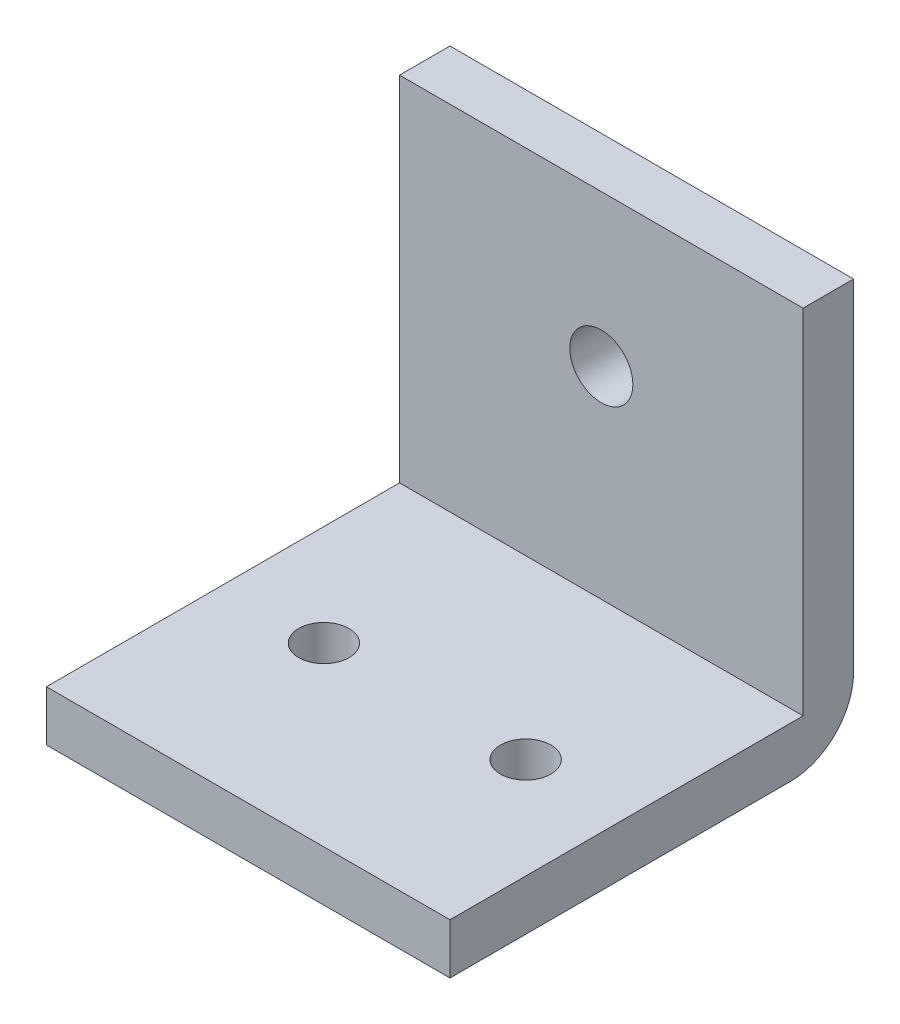
ISO-10303-21;
HEADER;
FILE_DESCRIPTION(('STEP AP214'),'2;1');
FILE_NAME('part.step','',(''),(''),'','','');
FILE_SCHEMA(('AUTOMOTIVE_DESIGN { 1 0 10303 214 1 1 1 1 }'));
ENDSEC;
DATA;
#1=APPLICATION_CONTEXT('core data for automotive mechanical design processes');
#2=APPLICATION_PROTOCOL_DEFINITION('international standard','automotive_design',2000,#1);
#3=PRODUCT_CONTEXT('',#1,'mechanical');
#4=PRODUCT('Part','Part','',(#3));
#5=PRODUCT_RELATED_PRODUCT_CATEGORY('part','',(#4));
#6=PRODUCT_DEFINITION_FORMATION('','',#4);
#7=PRODUCT_DEFINITION_CONTEXT('part definition',#1,'design');
#8=PRODUCT_DEFINITION('design','',#6,#7);
#9=PRODUCT_DEFINITION_SHAPE('','',#8);
#10=(LENGTH_UNIT() NAMED_UNIT(*) SI_UNIT(.MILLI.,.METRE.));
#11=(NAMED_UNIT(*) PLANE_ANGLE_UNIT() SI_UNIT($,.RADIAN.));
#12=(NAMED_UNIT(*) SI_UNIT($,.STERADIAN.) SOLID_ANGLE_UNIT());
#13=UNCERTAINTY_MEASURE_WITH_UNIT(LENGTH_MEASURE(1.E-05),#10,'distance_accuracy_value','');
#14=(GEOMETRIC_REPRESENTATION_CONTEXT(3) GLOBAL_UNCERTAINTY_ASSIGNED_CONTEXT((#13)) GLOBAL_UNIT_ASSIGNED_CONTEXT((#10,
#11,#12)) REPRESENTATION_CONTEXT('',''));
#15=CARTESIAN_POINT('',(0.,0.,0.));
#16=DIRECTION('',(0.,0.,1.));
#17=DIRECTION('',(1.,0.,0.));
#18=AXIS2_PLACEMENT_3D('',#15,#16,#17);
#19=CARTESIAN_POINT('',(40.,0.,5.));
#20=DIRECTION('',(-1.,0.,0.));
#21=DIRECTION('',(0.,0.,1.));
#22=AXIS2_PLACEMENT_3D('',#19,#20,#21);
#23=PLANE('',#22);
#24=DIRECTION('',(0.,0.,-1.));
#25=VECTOR('',#24,1.);
#26=CARTESIAN_POINT('',(40.,0.,40.));
#27=LINE('',#26,#25);
#28=CARTESIAN_POINT('',(40.,0.,40.));
#29=VERTEX_POINT('',#28);
#30=CARTESIAN_POINT('',(40.,0.,6.25));
#31=VERTEX_POINT('',#30);
#32=EDGE_CURVE('E123',#29,#31,#27,.T.);
#33=ORIENTED_EDGE('',*,*,#32,.T.);
#34=CARTESIAN_POINT('',(40.,6.25,6.25));
#35=DIRECTION('',(-1.,0.,0.));
#36=DIRECTION('',(0.,0.,1.));
#37=AXIS2_PLACEMENT_3D('',#34,#35,#36);
#38=CIRCLE('',#37,6.25);
#39=CARTESIAN_POINT('',(40.,6.25,0.));
#40=VERTEX_POINT('',#39);
#41=EDGE_CURVE('E55',#31,#40,#38,.F.);
#42=ORIENTED_EDGE('',*,*,#41,.T.);
#43=DIRECTION('',(0.,1.,0.));
#44=VECTOR('',#43,1.);
#45=CARTESIAN_POINT('',(40.,0.,0.));
#46=LINE('',#45,#44);
#47=CARTESIAN_POINT('',(40.,40.,0.));
#48=VERTEX_POINT('',#47);
#49=EDGE_CURVE('E100',#40,#48,#46,.T.);
#50=ORIENTED_EDGE('',*,*,#49,.T.);
#51=DIRECTION('',(0.,0.,-1.));
#52=VECTOR('',#51,1.);
#53=CARTESIAN_POINT('',(40.,40.,5.));
#54=LINE('',#53,#52);
#55=CARTESIAN_POINT('',(40.,40.,5.));
#56=VERTEX_POINT('',#55);
#57=EDGE_CURVE('E149',#56,#48,#54,.T.);
#58=ORIENTED_EDGE('',*,*,#57,.F.);
#59=DIRECTION('',(0.,1.,0.));
#60=VECTOR('',#59,1.);
#61=CARTESIAN_POINT('',(40.,0.,5.));
#62=LINE('',#61,#60);
#63=CARTESIAN_POINT('',(40.,5.,5.));
#64=VERTEX_POINT('',#63);
#65=EDGE_CURVE('E126',#64,#56,#62,.T.);
#66=ORIENTED_EDGE('',*,*,#65,.F.);
#67=DIRECTION('',(0.,0.,-1.));
#68=VECTOR('',#67,1.);
#69=CARTESIAN_POINT('',(40.,5.,40.));
#70=LINE('',#69,#68);
#71=CARTESIAN_POINT('',(40.,5.,40.));
#72=VERTEX_POINT('',#71);
#73=EDGE_CURVE('E121',#72,#64,#70,.T.);
#74=ORIENTED_EDGE('',*,*,#73,.F.);
#75=DIRECTION('',(0.,1.,0.));
#76=VECTOR('',#75,1.);
#77=CARTESIAN_POINT('',(40.,0.,40.));
#78=LINE('',#77,#76);
#79=EDGE_CURVE('E108',#29,#72,#78,.T.);
#80=ORIENTED_EDGE('',*,*,#79,.F.);
#81=EDGE_LOOP('',(#33,#42,#50,#58,#66,#74,#80));
#82=FACE_BOUND('',#81,.T.);
#83=ADVANCED_FACE('F33',(#82),#23,.F.);
#84=CARTESIAN_POINT('',(0.,40.,5.));
#85=DIRECTION('',(0.,1.,0.));
#86=DIRECTION('',(0.,0.,1.));
#87=AXIS2_PLACEMENT_3D('',#84,#85,#86);
#88=PLANE('',#87);
#89=DIRECTION('',(1.,0.,0.));
#90=VECTOR('',#89,1.);
#91=CARTESIAN_POINT('',(0.,40.,0.));
#92=LINE('',#91,#90);
#93=CARTESIAN_POINT('',(0.,40.,0.));
#94=VERTEX_POINT('',#93);
#95=EDGE_CURVE('E140',#94,#48,#92,.T.);
#96=ORIENTED_EDGE('',*,*,#95,.F.);
#97=DIRECTION('',(0.,0.,-1.));
#98=VECTOR('',#97,1.);
#99=CARTESIAN_POINT('',(0.,40.,5.));
#100=LINE('',#99,#98);
#101=CARTESIAN_POINT('',(0.,40.,5.));
#102=VERTEX_POINT('',#101);
#103=EDGE_CURVE('E138',#102,#94,#100,.T.);
#104=ORIENTED_EDGE('',*,*,#103,.F.);
#105=DIRECTION('',(1.,0.,0.));
#106=VECTOR('',#105,1.);
#107=CARTESIAN_POINT('',(0.,40.,5.));
#108=LINE('',#107,#106);
#109=EDGE_CURVE('E128',#102,#56,#108,.T.);
#110=ORIENTED_EDGE('',*,*,#109,.T.);
#111=ORIENTED_EDGE('',*,*,#57,.T.);
#112=EDGE_LOOP('',(#96,#104,#110,#111));
#113=FACE_BOUND('',#112,.T.);
#114=ADVANCED_FACE('F169',(#113),#88,.T.);
#115=CARTESIAN_POINT('',(0.,0.,5.));
#116=DIRECTION('',(-1.,0.,0.));
#117=DIRECTION('',(0.,0.,1.));
#118=AXIS2_PLACEMENT_3D('',#115,#116,#117);
#119=PLANE('',#118);
#120=DIRECTION('',(0.,1.,0.));
#121=VECTOR('',#120,1.);
#122=CARTESIAN_POINT('',(0.,0.,0.));
#123=LINE('',#122,#121);
#124=CARTESIAN_POINT('',(0.,6.25,0.));
#125=VERTEX_POINT('',#124);
#126=EDGE_CURVE('E143',#125,#94,#123,.T.);
#127=ORIENTED_EDGE('',*,*,#126,.F.);
#128=CARTESIAN_POINT('',(0.,6.25,6.25));
#129=DIRECTION('',(-1.,0.,0.));
#130=DIRECTION('',(0.,0.,1.));
#131=AXIS2_PLACEMENT_3D('',#128,#129,#130);
#132=CIRCLE('',#131,6.25);
#133=CARTESIAN_POINT('',(0.,0.,6.25));
#134=VERTEX_POINT('',#133);
#135=EDGE_CURVE('E11',#125,#134,#132,.T.);
#136=ORIENTED_EDGE('',*,*,#135,.T.);
#137=DIRECTION('',(0.,0.,-1.));
#138=VECTOR('',#137,1.);
#139=CARTESIAN_POINT('',(0.,0.,40.));
#140=LINE('',#139,#138);
#141=CARTESIAN_POINT('',(0.,0.,40.));
#142=VERTEX_POINT('',#141);
#143=EDGE_CURVE('E101',#142,#134,#140,.T.);
#144=ORIENTED_EDGE('',*,*,#143,.F.);
#145=DIRECTION('',(0.,1.,0.));
#146=VECTOR('',#145,1.);
#147=CARTESIAN_POINT('',(0.,0.,40.));
#148=LINE('',#147,#146);
#149=CARTESIAN_POINT('',(0.,5.,40.));
#150=VERTEX_POINT('',#149);
#151=EDGE_CURVE('E106',#142,#150,#148,.T.);
#152=ORIENTED_EDGE('',*,*,#151,.T.);
#153=DIRECTION('',(0.,0.,-1.));
#154=VECTOR('',#153,1.);
#155=CARTESIAN_POINT('',(0.,5.,40.));
#156=LINE('',#155,#154);
#157=CARTESIAN_POINT('',(0.,5.,5.));
#158=VERTEX_POINT('',#157);
#159=EDGE_CURVE('E90',#150,#158,#156,.T.);
#160=ORIENTED_EDGE('',*,*,#159,.T.);
#161=DIRECTION('',(0.,1.,0.));
#162=VECTOR('',#161,1.);
#163=CARTESIAN_POINT('',(0.,0.,5.));
#164=LINE('',#163,#162);
#165=EDGE_CURVE('E132',#158,#102,#164,.T.);
#166=ORIENTED_EDGE('',*,*,#165,.T.);
#167=ORIENTED_EDGE('',*,*,#103,.T.);
#168=EDGE_LOOP('',(#127,#136,#144,#152,#160,#166,#167));
#169=FACE_BOUND('',#168,.T.);
#170=ADVANCED_FACE('F112',(#169),#119,.T.);
#171=CARTESIAN_POINT('',(20.,25.,5.));
#172=DIRECTION('',(0.,0.,-1.));
#173=DIRECTION('',(-1.,0.,0.));
#174=AXIS2_PLACEMENT_3D('',#171,#172,#173);
#175=CYLINDRICAL_SURFACE('',#174,3.125);
#176=CARTESIAN_POINT('',(20.,25.,5.));
#177=DIRECTION('',(0.,0.,1.));
#178=DIRECTION('',(1.,0.,0.));
#179=AXIS2_PLACEMENT_3D('',#176,#177,#178);
#180=CIRCLE('',#179,3.125);
#181=CARTESIAN_POINT('',(23.125,25.,5.));
#182=VERTEX_POINT('',#181);
#183=EDGE_CURVE('E135',#182,#182,#180,.T.);
#184=ORIENTED_EDGE('',*,*,#183,.T.);
#185=EDGE_LOOP('',(#184));
#186=FACE_BOUND('',#185,.T.);
#187=CARTESIAN_POINT('',(20.,25.,0.));
#188=DIRECTION('',(0.,0.,1.));
#189=DIRECTION('',(1.,0.,0.));
#190=AXIS2_PLACEMENT_3D('',#187,#188,#189);
#191=CIRCLE('',#190,3.125);
#192=CARTESIAN_POINT('',(23.125,25.,0.));
#193=VERTEX_POINT('',#192);
#194=EDGE_CURVE('E129',#193,#193,#191,.T.);
#195=ORIENTED_EDGE('',*,*,#194,.F.);
#196=EDGE_LOOP('',(#195));
#197=FACE_BOUND('',#196,.T.);
#198=ADVANCED_FACE('F190',(#186,#197),#175,.F.);
#199=CARTESIAN_POINT('',(0.,0.,5.));
#200=DIRECTION('',(0.,0.,1.));
#201=DIRECTION('',(1.,0.,0.));
#202=AXIS2_PLACEMENT_3D('',#199,#200,#201);
#203=PLANE('',#202);
#204=ORIENTED_EDGE('',*,*,#65,.T.);
#205=ORIENTED_EDGE('',*,*,#109,.F.);
#206=ORIENTED_EDGE('',*,*,#165,.F.);
#207=DIRECTION('',(1.,0.,0.));
#208=VECTOR('',#207,1.);
#209=CARTESIAN_POINT('',(0.,5.,5.));
#210=LINE('',#209,#208);
#211=EDGE_CURVE('E95',#158,#64,#210,.T.);
#212=ORIENTED_EDGE('',*,*,#211,.T.);
#213=EDGE_LOOP('',(#204,#205,#206,#212));
#214=FACE_BOUND('',#213,.T.);
#215=ORIENTED_EDGE('',*,*,#183,.F.);
#216=EDGE_LOOP('',(#215));
#217=FACE_BOUND('',#216,.T.);
#218=ADVANCED_FACE('F164',(#214,#217),#203,.T.);
#219=CARTESIAN_POINT('',(0.,0.,0.));
#220=DIRECTION('',(0.,0.,1.));
#221=DIRECTION('',(1.,0.,0.));
#222=AXIS2_PLACEMENT_3D('',#219,#220,#221);
#223=PLANE('',#222);
#224=ORIENTED_EDGE('',*,*,#49,.F.);
#225=DIRECTION('',(1.,0.,0.));
#226=VECTOR('',#225,1.);
#227=CARTESIAN_POINT('',(0.,6.25,0.));
#228=LINE('',#227,#226);
#229=EDGE_CURVE('E41',#40,#125,#228,.F.);
#230=ORIENTED_EDGE('',*,*,#229,.T.);
#231=ORIENTED_EDGE('',*,*,#126,.T.);
#232=ORIENTED_EDGE('',*,*,#95,.T.);
#233=EDGE_LOOP('',(#224,#230,#231,#232));
#234=FACE_BOUND('',#233,.T.);
#235=ORIENTED_EDGE('',*,*,#194,.T.);
#236=EDGE_LOOP('',(#235));
#237=FACE_BOUND('',#236,.T.);
#238=ADVANCED_FACE('F170',(#234,#237),#223,.F.);
#239=CARTESIAN_POINT('',(0.,5.,40.));
#240=DIRECTION('',(0.,1.,0.));
#241=DIRECTION('',(0.,0.,1.));
#242=AXIS2_PLACEMENT_3D('',#239,#240,#241);
#243=PLANE('',#242);
#244=CARTESIAN_POINT('',(10.,5.,22.5));
#245=DIRECTION('',(0.,1.,0.));
#246=DIRECTION('',(0.,0.,1.));
#247=AXIS2_PLACEMENT_3D('',#244,#245,#246);
#248=CIRCLE('',#247,2.5);
#249=CARTESIAN_POINT('',(10.,5.,25.));
#250=VERTEX_POINT('',#249);
#251=EDGE_CURVE('E213',#250,#250,#248,.T.);
#252=ORIENTED_EDGE('',*,*,#251,.F.);
#253=EDGE_LOOP('',(#252));
#254=FACE_BOUND('',#253,.T.);
#255=CARTESIAN_POINT('',(30.,5.,22.5));
#256=DIRECTION('',(0.,1.,0.));
#257=DIRECTION('',(0.,0.,-1.));
#258=AXIS2_PLACEMENT_3D('',#255,#256,#257);
#259=CIRCLE('',#258,2.5);
#260=CARTESIAN_POINT('',(30.,5.,20.));
#261=VERTEX_POINT('',#260);
#262=EDGE_CURVE('E218',#261,#261,#259,.T.);
#263=ORIENTED_EDGE('',*,*,#262,.F.);
#264=EDGE_LOOP('',(#263));
#265=FACE_BOUND('',#264,.T.);
#266=ORIENTED_EDGE('',*,*,#211,.F.);
#267=ORIENTED_EDGE('',*,*,#159,.F.);
#268=DIRECTION('',(1.,0.,0.));
#269=VECTOR('',#268,1.);
#270=CARTESIAN_POINT('',(0.,5.,40.));
#271=LINE('',#270,#269);
#272=EDGE_CURVE('E93',#150,#72,#271,.T.);
#273=ORIENTED_EDGE('',*,*,#272,.T.);
#274=ORIENTED_EDGE('',*,*,#73,.T.);
#275=EDGE_LOOP('',(#266,#267,#273,#274));
#276=FACE_BOUND('',#275,.T.);
#277=ADVANCED_FACE('F92',(#254,#265,#276),#243,.T.);
#278=CARTESIAN_POINT('',(0.,0.,40.));
#279=DIRECTION('',(0.,1.,0.));
#280=DIRECTION('',(0.,0.,1.));
#281=AXIS2_PLACEMENT_3D('',#278,#279,#280);
#282=PLANE('',#281);
#283=CARTESIAN_POINT('',(10.,0.,22.5));
#284=DIRECTION('',(0.,1.,0.));
#285=DIRECTION('',(0.,0.,1.));
#286=AXIS2_PLACEMENT_3D('',#283,#284,#285);
#287=CIRCLE('',#286,2.5);
#288=CARTESIAN_POINT('',(10.,0.,25.));
#289=VERTEX_POINT('',#288);
#290=EDGE_CURVE('E110',#289,#289,#287,.T.);
#291=ORIENTED_EDGE('',*,*,#290,.T.);
#292=EDGE_LOOP('',(#291));
#293=FACE_BOUND('',#292,.T.);
#294=CARTESIAN_POINT('',(30.,0.,22.5));
#295=DIRECTION('',(0.,1.,0.));
#296=DIRECTION('',(0.,0.,-1.));
#297=AXIS2_PLACEMENT_3D('',#294,#295,#296);
#298=CIRCLE('',#297,2.5);
#299=CARTESIAN_POINT('',(30.,0.,20.));
#300=VERTEX_POINT('',#299);
#301=EDGE_CURVE('E214',#300,#300,#298,.T.);
#302=ORIENTED_EDGE('',*,*,#301,.T.);
#303=EDGE_LOOP('',(#302));
#304=FACE_BOUND('',#303,.T.);
#305=ORIENTED_EDGE('',*,*,#143,.T.);
#306=DIRECTION('',(1.,0.,0.));
#307=VECTOR('',#306,1.);
#308=CARTESIAN_POINT('',(0.,0.,6.25));
#309=LINE('',#308,#307);
#310=EDGE_CURVE('E152',#134,#31,#309,.T.);
#311=ORIENTED_EDGE('',*,*,#310,.T.);
#312=ORIENTED_EDGE('',*,*,#32,.F.);
#313=DIRECTION('',(1.,0.,0.));
#314=VECTOR('',#313,1.);
#315=CARTESIAN_POINT('',(0.,0.,40.));
#316=LINE('',#315,#314);
#317=EDGE_CURVE('E115',#142,#29,#316,.T.);
#318=ORIENTED_EDGE('',*,*,#317,.F.);
#319=EDGE_LOOP('',(#305,#311,#312,#318));
#320=FACE_BOUND('',#319,.T.);
#321=ADVANCED_FACE('F158',(#293,#304,#320),#282,.F.);
#322=CARTESIAN_POINT('',(0.,0.,40.));
#323=DIRECTION('',(0.,0.,1.));
#324=DIRECTION('',(1.,0.,0.));
#325=AXIS2_PLACEMENT_3D('',#322,#323,#324);
#326=PLANE('',#325);
#327=ORIENTED_EDGE('',*,*,#272,.F.);
#328=ORIENTED_EDGE('',*,*,#151,.F.);
#329=ORIENTED_EDGE('',*,*,#317,.T.);
#330=ORIENTED_EDGE('',*,*,#79,.T.);
#331=EDGE_LOOP('',(#327,#328,#329,#330));
#332=FACE_BOUND('',#331,.T.);
#333=ADVANCED_FACE('F105',(#332),#326,.T.);
#334=CARTESIAN_POINT('',(0.,6.25,6.25));
#335=DIRECTION('',(1.,0.,0.));
#336=DIRECTION('',(0.,0.,-1.));
#337=AXIS2_PLACEMENT_3D('',#334,#335,#336);
#338=CYLINDRICAL_SURFACE('',#337,6.25);
#339=ORIENTED_EDGE('',*,*,#135,.F.);
#340=ORIENTED_EDGE('',*,*,#229,.F.);
#341=ORIENTED_EDGE('',*,*,#41,.F.);
#342=ORIENTED_EDGE('',*,*,#310,.F.);
#343=EDGE_LOOP('',(#339,#340,#341,#342));
#344=FACE_BOUND('',#343,.T.);
#345=ADVANCED_FACE('F35',(#344),#338,.T.);
#346=CARTESIAN_POINT('',(30.,0.,22.5));
#347=DIRECTION('',(0.,1.,0.));
#348=DIRECTION('',(0.,0.,1.));
#349=AXIS2_PLACEMENT_3D('',#346,#347,#348);
#350=CYLINDRICAL_SURFACE('',#349,2.5);
#351=ORIENTED_EDGE('',*,*,#301,.F.);
#352=EDGE_LOOP('',(#351));
#353=FACE_BOUND('',#352,.T.);
#354=ORIENTED_EDGE('',*,*,#262,.T.);
#355=EDGE_LOOP('',(#354));
#356=FACE_BOUND('',#355,.T.);
#357=ADVANCED_FACE('F173',(#353,#356),#350,.F.);
#358=CARTESIAN_POINT('',(10.,0.,22.5));
#359=DIRECTION('',(0.,1.,0.));
#360=DIRECTION('',(0.,0.,1.));
#361=AXIS2_PLACEMENT_3D('',#358,#359,#360);
#362=CYLINDRICAL_SURFACE('',#361,2.5);
#363=ORIENTED_EDGE('',*,*,#290,.F.);
#364=EDGE_LOOP('',(#363));
#365=FACE_BOUND('',#364,.T.);
#366=ORIENTED_EDGE('',*,*,#251,.T.);
#367=EDGE_LOOP('',(#366));
#368=FACE_BOUND('',#367,.T.);
#369=ADVANCED_FACE('F178',(#365,#368),#362,.F.);
#370=CLOSED_SHELL('',(#83,#114,#170,#198,#218,#238,#277,#321,#333,#345,#357,#369));
#371=MANIFOLD_SOLID_BREP('B2',#370);
#372=ADVANCED_BREP_SHAPE_REPRESENTATION('',(#18,#371),#14);
#373=SHAPE_DEFINITION_REPRESENTATION(#9,#372);
ENDSEC;
END-ISO-10303-21;
